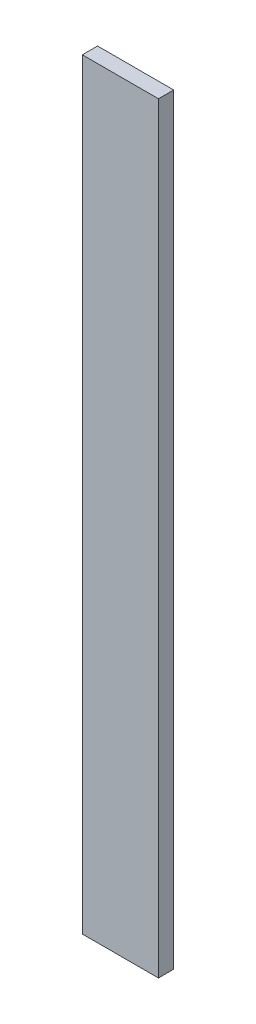
ISO-10303-21;
HEADER;
FILE_DESCRIPTION(('STEP AP214'),'2;1');
FILE_NAME('part.step','',(''),(''),'','','');
FILE_SCHEMA(('AUTOMOTIVE_DESIGN { 1 0 10303 214 1 1 1 1 }'));
ENDSEC;
DATA;
#1=APPLICATION_CONTEXT('core data for automotive mechanical design processes');
#2=APPLICATION_PROTOCOL_DEFINITION('international standard','automotive_design',2000,#1);
#3=PRODUCT_CONTEXT('',#1,'mechanical');
#4=PRODUCT('Part','Part','',(#3));
#5=PRODUCT_RELATED_PRODUCT_CATEGORY('part','',(#4));
#6=PRODUCT_DEFINITION_FORMATION('','',#4);
#7=PRODUCT_DEFINITION_CONTEXT('part definition',#1,'design');
#8=PRODUCT_DEFINITION('design','',#6,#7);
#9=PRODUCT_DEFINITION_SHAPE('','',#8);
#10=(LENGTH_UNIT() NAMED_UNIT(*) SI_UNIT(.MILLI.,.METRE.));
#11=(NAMED_UNIT(*) PLANE_ANGLE_UNIT() SI_UNIT($,.RADIAN.));
#12=(NAMED_UNIT(*) SI_UNIT($,.STERADIAN.) SOLID_ANGLE_UNIT());
#13=UNCERTAINTY_MEASURE_WITH_UNIT(LENGTH_MEASURE(1.E-05),#10,'distance_accuracy_value','');
#14=(GEOMETRIC_REPRESENTATION_CONTEXT(3) GLOBAL_UNCERTAINTY_ASSIGNED_CONTEXT((#13)) GLOBAL_UNIT_ASSIGNED_CONTEXT((#10,
#11,#12)) REPRESENTATION_CONTEXT('',''));
#15=CARTESIAN_POINT('',(0.,0.,0.));
#16=DIRECTION('',(0.,0.,1.));
#17=DIRECTION('',(1.,0.,0.));
#18=AXIS2_PLACEMENT_3D('',#15,#16,#17);
#19=CARTESIAN_POINT('',(25.,500.,5.));
#20=DIRECTION('',(-1.,0.,0.));
#21=DIRECTION('',(0.,0.,1.));
#22=AXIS2_PLACEMENT_3D('',#19,#20,#21);
#23=PLANE('',#22);
#24=DIRECTION('',(0.,0.,-1.));
#25=VECTOR('',#24,1.);
#26=CARTESIAN_POINT('',(25.,0.,5.));
#27=LINE('',#26,#25);
#28=CARTESIAN_POINT('',(25.,0.,5.));
#29=VERTEX_POINT('',#28);
#30=CARTESIAN_POINT('',(25.,0.,-5.));
#31=VERTEX_POINT('',#30);
#32=EDGE_CURVE('E96',#29,#31,#27,.T.);
#33=ORIENTED_EDGE('',*,*,#32,.T.);
#34=DIRECTION('',(0.,-1.,0.));
#35=VECTOR('',#34,1.);
#36=CARTESIAN_POINT('',(25.,500.,-5.));
#37=LINE('',#36,#35);
#38=CARTESIAN_POINT('',(25.,500.,-5.));
#39=VERTEX_POINT('',#38);
#40=EDGE_CURVE('E11',#39,#31,#37,.T.);
#41=ORIENTED_EDGE('',*,*,#40,.F.);
#42=DIRECTION('',(0.,0.,-1.));
#43=VECTOR('',#42,1.);
#44=CARTESIAN_POINT('',(25.,500.,5.));
#45=LINE('',#44,#43);
#46=CARTESIAN_POINT('',(25.,500.,5.));
#47=VERTEX_POINT('',#46);
#48=EDGE_CURVE('E84',#47,#39,#45,.T.);
#49=ORIENTED_EDGE('',*,*,#48,.F.);
#50=DIRECTION('',(0.,-1.,0.));
#51=VECTOR('',#50,1.);
#52=CARTESIAN_POINT('',(25.,500.,5.));
#53=LINE('',#52,#51);
#54=EDGE_CURVE('E92',#47,#29,#53,.T.);
#55=ORIENTED_EDGE('',*,*,#54,.T.);
#56=EDGE_LOOP('',(#33,#41,#49,#55));
#57=FACE_BOUND('',#56,.T.);
#58=ADVANCED_FACE('F33',(#57),#23,.F.);
#59=CARTESIAN_POINT('',(-25.,500.,-5.));
#60=DIRECTION('',(0.,0.,1.));
#61=DIRECTION('',(1.,0.,0.));
#62=AXIS2_PLACEMENT_3D('',#59,#60,#61);
#63=PLANE('',#62);
#64=DIRECTION('',(-1.,0.,0.));
#65=VECTOR('',#64,1.);
#66=CARTESIAN_POINT('',(-25.,0.,-5.));
#67=LINE('',#66,#65);
#68=CARTESIAN_POINT('',(-25.,0.,-5.));
#69=VERTEX_POINT('',#68);
#70=EDGE_CURVE('E88',#31,#69,#67,.T.);
#71=ORIENTED_EDGE('',*,*,#70,.T.);
#72=DIRECTION('',(0.,-1.,0.));
#73=VECTOR('',#72,1.);
#74=CARTESIAN_POINT('',(-25.,500.,-5.));
#75=LINE('',#74,#73);
#76=CARTESIAN_POINT('',(-25.,500.,-5.));
#77=VERTEX_POINT('',#76);
#78=EDGE_CURVE('E41',#77,#69,#75,.T.);
#79=ORIENTED_EDGE('',*,*,#78,.F.);
#80=DIRECTION('',(-1.,0.,0.));
#81=VECTOR('',#80,1.);
#82=CARTESIAN_POINT('',(-25.,500.,-5.));
#83=LINE('',#82,#81);
#84=EDGE_CURVE('E79',#39,#77,#83,.T.);
#85=ORIENTED_EDGE('',*,*,#84,.F.);
#86=ORIENTED_EDGE('',*,*,#40,.T.);
#87=EDGE_LOOP('',(#71,#79,#85,#86));
#88=FACE_BOUND('',#87,.T.);
#89=ADVANCED_FACE('F87',(#88),#63,.F.);
#90=CARTESIAN_POINT('',(-25.,500.,5.));
#91=DIRECTION('',(1.,0.,0.));
#92=DIRECTION('',(0.,0.,-1.));
#93=AXIS2_PLACEMENT_3D('',#90,#91,#92);
#94=PLANE('',#93);
#95=DIRECTION('',(0.,0.,1.));
#96=VECTOR('',#95,1.);
#97=CARTESIAN_POINT('',(-25.,0.,5.));
#98=LINE('',#97,#96);
#99=CARTESIAN_POINT('',(-25.,0.,5.));
#100=VERTEX_POINT('',#99);
#101=EDGE_CURVE('E66',#69,#100,#98,.T.);
#102=ORIENTED_EDGE('',*,*,#101,.T.);
#103=DIRECTION('',(0.,-1.,0.));
#104=VECTOR('',#103,1.);
#105=CARTESIAN_POINT('',(-25.,500.,5.));
#106=LINE('',#105,#104);
#107=CARTESIAN_POINT('',(-25.,500.,5.));
#108=VERTEX_POINT('',#107);
#109=EDGE_CURVE('E89',#108,#100,#106,.T.);
#110=ORIENTED_EDGE('',*,*,#109,.F.);
#111=DIRECTION('',(0.,0.,1.));
#112=VECTOR('',#111,1.);
#113=CARTESIAN_POINT('',(-25.,500.,5.));
#114=LINE('',#113,#112);
#115=EDGE_CURVE('E82',#77,#108,#114,.T.);
#116=ORIENTED_EDGE('',*,*,#115,.F.);
#117=ORIENTED_EDGE('',*,*,#78,.T.);
#118=EDGE_LOOP('',(#102,#110,#116,#117));
#119=FACE_BOUND('',#118,.T.);
#120=ADVANCED_FACE('F90',(#119),#94,.F.);
#121=CARTESIAN_POINT('',(-25.,500.,5.));
#122=DIRECTION('',(0.,0.,-1.));
#123=DIRECTION('',(-1.,0.,0.));
#124=AXIS2_PLACEMENT_3D('',#121,#122,#123);
#125=PLANE('',#124);
#126=DIRECTION('',(1.,0.,0.));
#127=VECTOR('',#126,1.);
#128=CARTESIAN_POINT('',(-25.,0.,5.));
#129=LINE('',#128,#127);
#130=EDGE_CURVE('E72',#100,#29,#129,.T.);
#131=ORIENTED_EDGE('',*,*,#130,.T.);
#132=ORIENTED_EDGE('',*,*,#54,.F.);
#133=DIRECTION('',(1.,0.,0.));
#134=VECTOR('',#133,1.);
#135=CARTESIAN_POINT('',(-25.,500.,5.));
#136=LINE('',#135,#134);
#137=EDGE_CURVE('E49',#108,#47,#136,.T.);
#138=ORIENTED_EDGE('',*,*,#137,.F.);
#139=ORIENTED_EDGE('',*,*,#109,.T.);
#140=EDGE_LOOP('',(#131,#132,#138,#139));
#141=FACE_BOUND('',#140,.T.);
#142=ADVANCED_FACE('F103',(#141),#125,.F.);
#143=CARTESIAN_POINT('',(0.,500.,0.));
#144=DIRECTION('',(0.,-1.,0.));
#145=DIRECTION('',(0.,0.,-1.));
#146=AXIS2_PLACEMENT_3D('',#143,#144,#145);
#147=PLANE('',#146);
#148=ORIENTED_EDGE('',*,*,#48,.T.);
#149=ORIENTED_EDGE('',*,*,#84,.T.);
#150=ORIENTED_EDGE('',*,*,#115,.T.);
#151=ORIENTED_EDGE('',*,*,#137,.T.);
#152=EDGE_LOOP('',(#148,#149,#150,#151));
#153=FACE_BOUND('',#152,.T.);
#154=ADVANCED_FACE('F80',(#153),#147,.F.);
#155=CARTESIAN_POINT('',(0.,0.,0.));
#156=DIRECTION('',(0.,-1.,0.));
#157=DIRECTION('',(0.,0.,-1.));
#158=AXIS2_PLACEMENT_3D('',#155,#156,#157);
#159=PLANE('',#158);
#160=ORIENTED_EDGE('',*,*,#32,.F.);
#161=ORIENTED_EDGE('',*,*,#130,.F.);
#162=ORIENTED_EDGE('',*,*,#101,.F.);
#163=ORIENTED_EDGE('',*,*,#70,.F.);
#164=EDGE_LOOP('',(#160,#161,#162,#163));
#165=FACE_BOUND('',#164,.T.);
#166=ADVANCED_FACE('F106',(#165),#159,.T.);
#167=CLOSED_SHELL('',(#58,#89,#120,#142,#154,#166));
#168=MANIFOLD_SOLID_BREP('B2',#167);
#169=ADVANCED_BREP_SHAPE_REPRESENTATION('',(#18,#168),#14);
#170=SHAPE_DEFINITION_REPRESENTATION(#9,#169);
ENDSEC;
END-ISO-10303-21;
